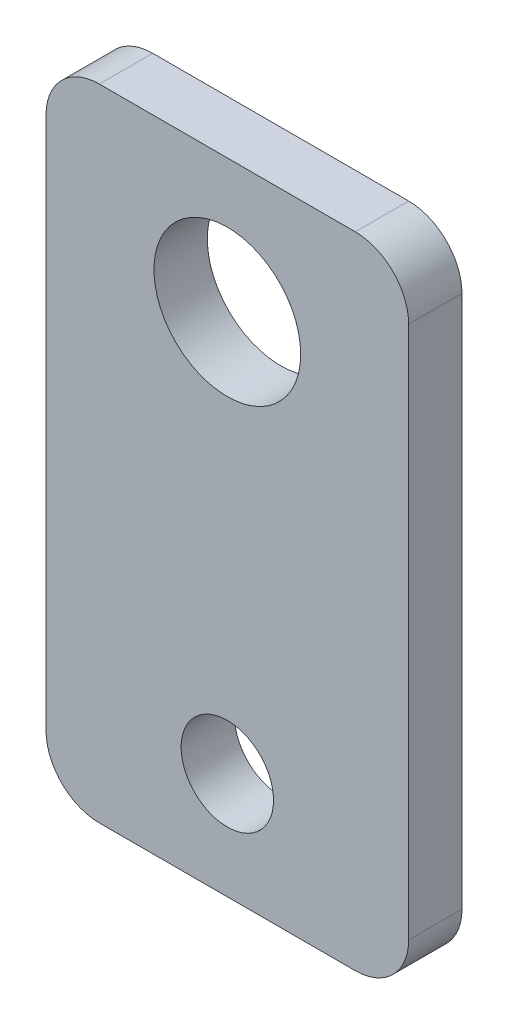
ISO-10303-21;
HEADER;
FILE_DESCRIPTION(('STEP AP214'),'2;1');
FILE_NAME('part.step','',(''),(''),'','','');
FILE_SCHEMA(('AUTOMOTIVE_DESIGN { 1 0 10303 214 1 1 1 1 }'));
ENDSEC;
DATA;
#1=APPLICATION_CONTEXT('core data for automotive mechanical design processes');
#2=APPLICATION_PROTOCOL_DEFINITION('international standard','automotive_design',2000,#1);
#3=PRODUCT_CONTEXT('',#1,'mechanical');
#4=PRODUCT('Part','Part','',(#3));
#5=PRODUCT_RELATED_PRODUCT_CATEGORY('part','',(#4));
#6=PRODUCT_DEFINITION_FORMATION('','',#4);
#7=PRODUCT_DEFINITION_CONTEXT('part definition',#1,'design');
#8=PRODUCT_DEFINITION('design','',#6,#7);
#9=PRODUCT_DEFINITION_SHAPE('','',#8);
#10=(LENGTH_UNIT() NAMED_UNIT(*) SI_UNIT(.MILLI.,.METRE.));
#11=(NAMED_UNIT(*) PLANE_ANGLE_UNIT() SI_UNIT($,.RADIAN.));
#12=(NAMED_UNIT(*) SI_UNIT($,.STERADIAN.) SOLID_ANGLE_UNIT());
#13=UNCERTAINTY_MEASURE_WITH_UNIT(LENGTH_MEASURE(1.E-05),#10,'distance_accuracy_value','');
#14=(GEOMETRIC_REPRESENTATION_CONTEXT(3) GLOBAL_UNCERTAINTY_ASSIGNED_CONTEXT((#13)) GLOBAL_UNIT_ASSIGNED_CONTEXT((#10,
#11,#12)) REPRESENTATION_CONTEXT('',''));
#15=CARTESIAN_POINT('',(0.,0.,0.));
#16=DIRECTION('',(0.,0.,1.));
#17=DIRECTION('',(1.,0.,0.));
#18=AXIS2_PLACEMENT_3D('',#15,#16,#17);
#19=CARTESIAN_POINT('',(0.,0.,3.175));
#20=DIRECTION('',(0.,0.,1.));
#21=DIRECTION('',(1.,0.,0.));
#22=AXIS2_PLACEMENT_3D('',#19,#20,#21);
#23=PLANE('',#22);
#24=CARTESIAN_POINT('',(0.,11.1125,3.175));
#25=DIRECTION('',(0.,0.,1.));
#26=DIRECTION('',(1.,0.,0.));
#27=AXIS2_PLACEMENT_3D('',#24,#25,#26);
#28=CIRCLE('',#27,4.3688);
#29=CARTESIAN_POINT('',(4.3688,11.1125,3.175));
#30=VERTEX_POINT('',#29);
#31=EDGE_CURVE('E127',#30,#30,#28,.T.);
#32=ORIENTED_EDGE('',*,*,#31,.F.);
#33=EDGE_LOOP('',(#32));
#34=FACE_BOUND('',#33,.T.);
#35=DIRECTION('',(1.,0.,0.));
#36=VECTOR('',#35,1.);
#37=CARTESIAN_POINT('',(-10.795,-19.05,3.175));
#38=LINE('',#37,#36);
#39=CARTESIAN_POINT('',(-7.61999999999999,-19.05,3.175));
#40=VERTEX_POINT('',#39);
#41=CARTESIAN_POINT('',(7.62,-19.05,3.175));
#42=VERTEX_POINT('',#41);
#43=EDGE_CURVE('E136',#40,#42,#38,.T.);
#44=ORIENTED_EDGE('',*,*,#43,.T.);
#45=CARTESIAN_POINT('',(7.62,-15.875,3.175));
#46=DIRECTION('',(0.,0.,1.));
#47=DIRECTION('',(1.,0.,0.));
#48=AXIS2_PLACEMENT_3D('',#45,#46,#47);
#49=CIRCLE('',#48,3.175);
#50=CARTESIAN_POINT('',(10.795,-15.875,3.175));
#51=VERTEX_POINT('',#50);
#52=EDGE_CURVE('E155',#42,#51,#49,.T.);
#53=ORIENTED_EDGE('',*,*,#52,.T.);
#54=DIRECTION('',(0.,1.,0.));
#55=VECTOR('',#54,1.);
#56=CARTESIAN_POINT('',(10.795,19.05,3.175));
#57=LINE('',#56,#55);
#58=CARTESIAN_POINT('',(10.795,15.875,3.175));
#59=VERTEX_POINT('',#58);
#60=EDGE_CURVE('E119',#51,#59,#57,.T.);
#61=ORIENTED_EDGE('',*,*,#60,.T.);
#62=CARTESIAN_POINT('',(7.62,15.875,3.175));
#63=DIRECTION('',(0.,0.,1.));
#64=DIRECTION('',(1.,0.,0.));
#65=AXIS2_PLACEMENT_3D('',#62,#63,#64);
#66=CIRCLE('',#65,3.175);
#67=CARTESIAN_POINT('',(7.62,19.05,3.175));
#68=VERTEX_POINT('',#67);
#69=EDGE_CURVE('E150',#59,#68,#66,.T.);
#70=ORIENTED_EDGE('',*,*,#69,.T.);
#71=DIRECTION('',(-1.,0.,0.));
#72=VECTOR('',#71,1.);
#73=CARTESIAN_POINT('',(-10.795,19.05,3.175));
#74=LINE('',#73,#72);
#75=CARTESIAN_POINT('',(-7.62,19.05,3.175));
#76=VERTEX_POINT('',#75);
#77=EDGE_CURVE('E166',#68,#76,#74,.T.);
#78=ORIENTED_EDGE('',*,*,#77,.T.);
#79=CARTESIAN_POINT('',(-7.62,15.875,3.175));
#80=DIRECTION('',(0.,0.,1.));
#81=DIRECTION('',(1.,0.,0.));
#82=AXIS2_PLACEMENT_3D('',#79,#80,#81);
#83=CIRCLE('',#82,3.175);
#84=CARTESIAN_POINT('',(-10.795,15.875,3.175));
#85=VERTEX_POINT('',#84);
#86=EDGE_CURVE('E55',#76,#85,#83,.T.);
#87=ORIENTED_EDGE('',*,*,#86,.T.);
#88=DIRECTION('',(0.,-1.,0.));
#89=VECTOR('',#88,1.);
#90=CARTESIAN_POINT('',(-10.795,19.05,3.175));
#91=LINE('',#90,#89);
#92=CARTESIAN_POINT('',(-10.795,-15.875,3.175));
#93=VERTEX_POINT('',#92);
#94=EDGE_CURVE('E174',#85,#93,#91,.T.);
#95=ORIENTED_EDGE('',*,*,#94,.T.);
#96=CARTESIAN_POINT('',(-7.61999999999999,-15.875,3.175));
#97=DIRECTION('',(0.,0.,1.));
#98=DIRECTION('',(1.,0.,0.));
#99=AXIS2_PLACEMENT_3D('',#96,#97,#98);
#100=CIRCLE('',#99,3.175);
#101=EDGE_CURVE('E153',#93,#40,#100,.T.);
#102=ORIENTED_EDGE('',*,*,#101,.T.);
#103=EDGE_LOOP('',(#44,#53,#61,#70,#78,#87,#95,#102));
#104=FACE_BOUND('',#103,.T.);
#105=CARTESIAN_POINT('',(0.,-12.7,3.175));
#106=DIRECTION('',(0.,0.,1.));
#107=DIRECTION('',(1.,0.,0.));
#108=AXIS2_PLACEMENT_3D('',#105,#106,#107);
#109=CIRCLE('',#108,2.75082);
#110=CARTESIAN_POINT('',(2.75082,-12.7,3.175));
#111=VERTEX_POINT('',#110);
#112=EDGE_CURVE('E181',#111,#111,#109,.T.);
#113=ORIENTED_EDGE('',*,*,#112,.F.);
#114=EDGE_LOOP('',(#113));
#115=FACE_BOUND('',#114,.T.);
#116=ADVANCED_FACE('F33',(#34,#104,#115),#23,.T.);
#117=CARTESIAN_POINT('',(0.,0.,0.));
#118=DIRECTION('',(0.,0.,1.));
#119=DIRECTION('',(1.,0.,0.));
#120=AXIS2_PLACEMENT_3D('',#117,#118,#119);
#121=PLANE('',#120);
#122=DIRECTION('',(0.,1.,0.));
#123=VECTOR('',#122,1.);
#124=CARTESIAN_POINT('',(10.795,19.05,0.));
#125=LINE('',#124,#123);
#126=CARTESIAN_POINT('',(10.795,-15.875,0.));
#127=VERTEX_POINT('',#126);
#128=CARTESIAN_POINT('',(10.795,15.875,0.));
#129=VERTEX_POINT('',#128);
#130=EDGE_CURVE('E116',#127,#129,#125,.T.);
#131=ORIENTED_EDGE('',*,*,#130,.F.);
#132=CARTESIAN_POINT('',(7.62,-15.875,0.));
#133=DIRECTION('',(0.,0.,1.));
#134=DIRECTION('',(1.,0.,0.));
#135=AXIS2_PLACEMENT_3D('',#132,#133,#134);
#136=CIRCLE('',#135,3.175);
#137=CARTESIAN_POINT('',(7.62,-19.05,0.));
#138=VERTEX_POINT('',#137);
#139=EDGE_CURVE('E99',#127,#138,#136,.F.);
#140=ORIENTED_EDGE('',*,*,#139,.T.);
#141=DIRECTION('',(1.,0.,0.));
#142=VECTOR('',#141,1.);
#143=CARTESIAN_POINT('',(-10.795,-19.05,0.));
#144=LINE('',#143,#142);
#145=CARTESIAN_POINT('',(-7.61999999999999,-19.05,0.));
#146=VERTEX_POINT('',#145);
#147=EDGE_CURVE('E140',#146,#138,#144,.T.);
#148=ORIENTED_EDGE('',*,*,#147,.F.);
#149=CARTESIAN_POINT('',(-7.61999999999999,-15.875,0.));
#150=DIRECTION('',(0.,0.,1.));
#151=DIRECTION('',(1.,0.,0.));
#152=AXIS2_PLACEMENT_3D('',#149,#150,#151);
#153=CIRCLE('',#152,3.175);
#154=CARTESIAN_POINT('',(-10.795,-15.875,0.));
#155=VERTEX_POINT('',#154);
#156=EDGE_CURVE('E110',#146,#155,#153,.F.);
#157=ORIENTED_EDGE('',*,*,#156,.T.);
#158=DIRECTION('',(0.,-1.,0.));
#159=VECTOR('',#158,1.);
#160=CARTESIAN_POINT('',(-10.795,19.05,0.));
#161=LINE('',#160,#159);
#162=CARTESIAN_POINT('',(-10.795,15.875,0.));
#163=VERTEX_POINT('',#162);
#164=EDGE_CURVE('E130',#163,#155,#161,.T.);
#165=ORIENTED_EDGE('',*,*,#164,.F.);
#166=CARTESIAN_POINT('',(-7.62,15.875,0.));
#167=DIRECTION('',(0.,0.,1.));
#168=DIRECTION('',(1.,0.,0.));
#169=AXIS2_PLACEMENT_3D('',#166,#167,#168);
#170=CIRCLE('',#169,3.175);
#171=CARTESIAN_POINT('',(-7.62,19.05,0.));
#172=VERTEX_POINT('',#171);
#173=EDGE_CURVE('E144',#163,#172,#170,.F.);
#174=ORIENTED_EDGE('',*,*,#173,.T.);
#175=DIRECTION('',(-1.,0.,0.));
#176=VECTOR('',#175,1.);
#177=CARTESIAN_POINT('',(-10.795,19.05,0.));
#178=LINE('',#177,#176);
#179=CARTESIAN_POINT('',(7.62,19.05,0.));
#180=VERTEX_POINT('',#179);
#181=EDGE_CURVE('E126',#180,#172,#178,.T.);
#182=ORIENTED_EDGE('',*,*,#181,.F.);
#183=CARTESIAN_POINT('',(7.62,15.875,0.));
#184=DIRECTION('',(0.,0.,1.));
#185=DIRECTION('',(1.,0.,0.));
#186=AXIS2_PLACEMENT_3D('',#183,#184,#185);
#187=CIRCLE('',#186,3.175);
#188=EDGE_CURVE('E120',#180,#129,#187,.F.);
#189=ORIENTED_EDGE('',*,*,#188,.T.);
#190=EDGE_LOOP('',(#131,#140,#148,#157,#165,#174,#182,#189));
#191=FACE_BOUND('',#190,.T.);
#192=CARTESIAN_POINT('',(0.,11.1125,0.));
#193=DIRECTION('',(0.,0.,1.));
#194=DIRECTION('',(1.,0.,0.));
#195=AXIS2_PLACEMENT_3D('',#192,#193,#194);
#196=CIRCLE('',#195,4.3688);
#197=CARTESIAN_POINT('',(4.3688,11.1125,0.));
#198=VERTEX_POINT('',#197);
#199=EDGE_CURVE('E133',#198,#198,#196,.T.);
#200=ORIENTED_EDGE('',*,*,#199,.T.);
#201=EDGE_LOOP('',(#200));
#202=FACE_BOUND('',#201,.T.);
#203=CARTESIAN_POINT('',(0.,-12.7,0.));
#204=DIRECTION('',(0.,0.,1.));
#205=DIRECTION('',(1.,0.,0.));
#206=AXIS2_PLACEMENT_3D('',#203,#204,#205);
#207=CIRCLE('',#206,2.75082);
#208=CARTESIAN_POINT('',(2.75082,-12.7,0.));
#209=VERTEX_POINT('',#208);
#210=EDGE_CURVE('E183',#209,#209,#207,.T.);
#211=ORIENTED_EDGE('',*,*,#210,.T.);
#212=EDGE_LOOP('',(#211));
#213=FACE_BOUND('',#212,.T.);
#214=ADVANCED_FACE('F123',(#191,#202,#213),#121,.F.);
#215=CARTESIAN_POINT('',(10.795,19.05,3.175));
#216=DIRECTION('',(-1.,0.,0.));
#217=DIRECTION('',(0.,-1.,0.));
#218=AXIS2_PLACEMENT_3D('',#215,#216,#217);
#219=PLANE('',#218);
#220=ORIENTED_EDGE('',*,*,#60,.F.);
#221=DIRECTION('',(0.,0.,-1.));
#222=VECTOR('',#221,1.);
#223=CARTESIAN_POINT('',(10.795,-15.875,3.175));
#224=LINE('',#223,#222);
#225=EDGE_CURVE('E103',#51,#127,#224,.T.);
#226=ORIENTED_EDGE('',*,*,#225,.T.);
#227=ORIENTED_EDGE('',*,*,#130,.T.);
#228=DIRECTION('',(0.,0.,-1.));
#229=VECTOR('',#228,1.);
#230=CARTESIAN_POINT('',(10.795,15.875,3.175));
#231=LINE('',#230,#229);
#232=EDGE_CURVE('E121',#129,#59,#231,.F.);
#233=ORIENTED_EDGE('',*,*,#232,.T.);
#234=EDGE_LOOP('',(#220,#226,#227,#233));
#235=FACE_BOUND('',#234,.T.);
#236=ADVANCED_FACE('F115',(#235),#219,.F.);
#237=CARTESIAN_POINT('',(-10.795,19.05,3.175));
#238=DIRECTION('',(0.,-1.,0.));
#239=DIRECTION('',(0.,0.,-1.));
#240=AXIS2_PLACEMENT_3D('',#237,#238,#239);
#241=PLANE('',#240);
#242=ORIENTED_EDGE('',*,*,#181,.T.);
#243=DIRECTION('',(0.,0.,-1.));
#244=VECTOR('',#243,1.);
#245=CARTESIAN_POINT('',(-7.62,19.05,3.175));
#246=LINE('',#245,#244);
#247=EDGE_CURVE('E11',#172,#76,#246,.F.);
#248=ORIENTED_EDGE('',*,*,#247,.T.);
#249=ORIENTED_EDGE('',*,*,#77,.F.);
#250=DIRECTION('',(0.,0.,-1.));
#251=VECTOR('',#250,1.);
#252=CARTESIAN_POINT('',(7.62,19.05,3.175));
#253=LINE('',#252,#251);
#254=EDGE_CURVE('E41',#68,#180,#253,.T.);
#255=ORIENTED_EDGE('',*,*,#254,.T.);
#256=EDGE_LOOP('',(#242,#248,#249,#255));
#257=FACE_BOUND('',#256,.T.);
#258=ADVANCED_FACE('F164',(#257),#241,.F.);
#259=CARTESIAN_POINT('',(-10.795,19.05,3.175));
#260=DIRECTION('',(1.,0.,0.));
#261=DIRECTION('',(0.,1.,0.));
#262=AXIS2_PLACEMENT_3D('',#259,#260,#261);
#263=PLANE('',#262);
#264=ORIENTED_EDGE('',*,*,#164,.T.);
#265=DIRECTION('',(0.,0.,-1.));
#266=VECTOR('',#265,1.);
#267=CARTESIAN_POINT('',(-10.795,-15.875,3.175));
#268=LINE('',#267,#266);
#269=EDGE_CURVE('E48',#155,#93,#268,.F.);
#270=ORIENTED_EDGE('',*,*,#269,.T.);
#271=ORIENTED_EDGE('',*,*,#94,.F.);
#272=DIRECTION('',(0.,0.,-1.));
#273=VECTOR('',#272,1.);
#274=CARTESIAN_POINT('',(-10.795,15.875,3.175));
#275=LINE('',#274,#273);
#276=EDGE_CURVE('E157',#85,#163,#275,.T.);
#277=ORIENTED_EDGE('',*,*,#276,.T.);
#278=EDGE_LOOP('',(#264,#270,#271,#277));
#279=FACE_BOUND('',#278,.T.);
#280=ADVANCED_FACE('F173',(#279),#263,.F.);
#281=CARTESIAN_POINT('',(-10.795,-19.05,3.175));
#282=DIRECTION('',(0.,1.,0.));
#283=DIRECTION('',(0.,0.,1.));
#284=AXIS2_PLACEMENT_3D('',#281,#282,#283);
#285=PLANE('',#284);
#286=ORIENTED_EDGE('',*,*,#147,.T.);
#287=DIRECTION('',(0.,0.,-1.));
#288=VECTOR('',#287,1.);
#289=CARTESIAN_POINT('',(7.62,-19.05,3.175));
#290=LINE('',#289,#288);
#291=EDGE_CURVE('E104',#138,#42,#290,.F.);
#292=ORIENTED_EDGE('',*,*,#291,.T.);
#293=ORIENTED_EDGE('',*,*,#43,.F.);
#294=DIRECTION('',(0.,0.,-1.));
#295=VECTOR('',#294,1.);
#296=CARTESIAN_POINT('',(-7.61999999999999,-19.05,3.175));
#297=LINE('',#296,#295);
#298=EDGE_CURVE('E109',#40,#146,#297,.T.);
#299=ORIENTED_EDGE('',*,*,#298,.T.);
#300=EDGE_LOOP('',(#286,#292,#293,#299));
#301=FACE_BOUND('',#300,.T.);
#302=ADVANCED_FACE('F204',(#301),#285,.F.);
#303=CARTESIAN_POINT('',(0.,11.1125,3.175));
#304=DIRECTION('',(0.,0.,-1.));
#305=DIRECTION('',(-1.,0.,0.));
#306=AXIS2_PLACEMENT_3D('',#303,#304,#305);
#307=CYLINDRICAL_SURFACE('',#306,4.3688);
#308=ORIENTED_EDGE('',*,*,#31,.T.);
#309=EDGE_LOOP('',(#308));
#310=FACE_BOUND('',#309,.T.);
#311=ORIENTED_EDGE('',*,*,#199,.F.);
#312=EDGE_LOOP('',(#311));
#313=FACE_BOUND('',#312,.T.);
#314=ADVANCED_FACE('F201',(#310,#313),#307,.F.);
#315=CARTESIAN_POINT('',(0.,-12.7,3.175));
#316=DIRECTION('',(0.,0.,-1.));
#317=DIRECTION('',(-1.,0.,0.));
#318=AXIS2_PLACEMENT_3D('',#315,#316,#317);
#319=CYLINDRICAL_SURFACE('',#318,2.75082);
#320=ORIENTED_EDGE('',*,*,#112,.T.);
#321=EDGE_LOOP('',(#320));
#322=FACE_BOUND('',#321,.T.);
#323=ORIENTED_EDGE('',*,*,#210,.F.);
#324=EDGE_LOOP('',(#323));
#325=FACE_BOUND('',#324,.T.);
#326=ADVANCED_FACE('F189',(#322,#325),#319,.F.);
#327=CARTESIAN_POINT('',(7.62,-15.875,3.175));
#328=DIRECTION('',(0.,0.,-1.));
#329=DIRECTION('',(-1.,0.,0.));
#330=AXIS2_PLACEMENT_3D('',#327,#328,#329);
#331=CYLINDRICAL_SURFACE('',#330,3.175);
#332=ORIENTED_EDGE('',*,*,#52,.F.);
#333=ORIENTED_EDGE('',*,*,#291,.F.);
#334=ORIENTED_EDGE('',*,*,#139,.F.);
#335=ORIENTED_EDGE('',*,*,#225,.F.);
#336=EDGE_LOOP('',(#332,#333,#334,#335));
#337=FACE_BOUND('',#336,.T.);
#338=ADVANCED_FACE('F102',(#337),#331,.T.);
#339=CARTESIAN_POINT('',(-7.61999999999999,-15.875,3.175));
#340=DIRECTION('',(0.,0.,-1.));
#341=DIRECTION('',(-1.,0.,0.));
#342=AXIS2_PLACEMENT_3D('',#339,#340,#341);
#343=CYLINDRICAL_SURFACE('',#342,3.175);
#344=ORIENTED_EDGE('',*,*,#101,.F.);
#345=ORIENTED_EDGE('',*,*,#269,.F.);
#346=ORIENTED_EDGE('',*,*,#156,.F.);
#347=ORIENTED_EDGE('',*,*,#298,.F.);
#348=EDGE_LOOP('',(#344,#345,#346,#347));
#349=FACE_BOUND('',#348,.T.);
#350=ADVANCED_FACE('F216',(#349),#343,.T.);
#351=CARTESIAN_POINT('',(-7.62,15.875,3.175));
#352=DIRECTION('',(0.,0.,-1.));
#353=DIRECTION('',(-1.,0.,0.));
#354=AXIS2_PLACEMENT_3D('',#351,#352,#353);
#355=CYLINDRICAL_SURFACE('',#354,3.175);
#356=ORIENTED_EDGE('',*,*,#86,.F.);
#357=ORIENTED_EDGE('',*,*,#247,.F.);
#358=ORIENTED_EDGE('',*,*,#173,.F.);
#359=ORIENTED_EDGE('',*,*,#276,.F.);
#360=EDGE_LOOP('',(#356,#357,#358,#359));
#361=FACE_BOUND('',#360,.T.);
#362=ADVANCED_FACE('F172',(#361),#355,.T.);
#363=CARTESIAN_POINT('',(7.62,15.875,3.175));
#364=DIRECTION('',(0.,0.,-1.));
#365=DIRECTION('',(-1.,0.,0.));
#366=AXIS2_PLACEMENT_3D('',#363,#364,#365);
#367=CYLINDRICAL_SURFACE('',#366,3.175);
#368=ORIENTED_EDGE('',*,*,#69,.F.);
#369=ORIENTED_EDGE('',*,*,#232,.F.);
#370=ORIENTED_EDGE('',*,*,#188,.F.);
#371=ORIENTED_EDGE('',*,*,#254,.F.);
#372=EDGE_LOOP('',(#368,#369,#370,#371));
#373=FACE_BOUND('',#372,.T.);
#374=ADVANCED_FACE('F35',(#373),#367,.T.);
#375=CLOSED_SHELL('',(#116,#214,#236,#258,#280,#302,#314,#326,#338,#350,#362,#374));
#376=MANIFOLD_SOLID_BREP('B2',#375);
#377=ADVANCED_BREP_SHAPE_REPRESENTATION('',(#18,#376),#14);
#378=SHAPE_DEFINITION_REPRESENTATION(#9,#377);
ENDSEC;
END-ISO-10303-21;
